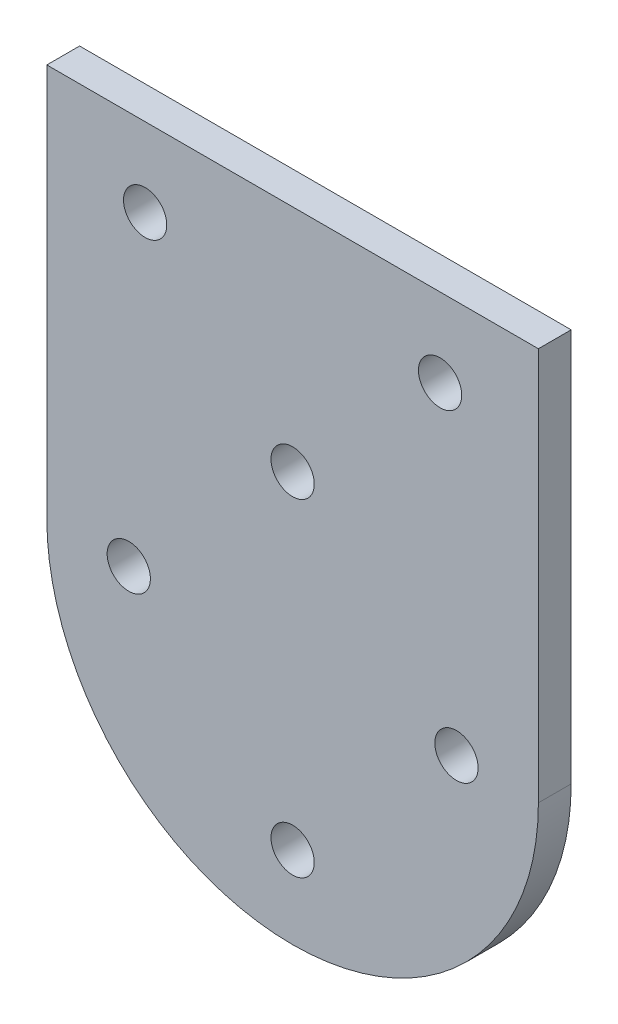
ISO-10303-21;
HEADER;
FILE_DESCRIPTION(('STEP AP214'),'2;1');
FILE_NAME('part.step','',(''),(''),'','','');
FILE_SCHEMA(('AUTOMOTIVE_DESIGN { 1 0 10303 214 1 1 1 1 }'));
ENDSEC;
DATA;
#1=APPLICATION_CONTEXT('core data for automotive mechanical design processes');
#2=APPLICATION_PROTOCOL_DEFINITION('international standard','automotive_design',2000,#1);
#3=PRODUCT_CONTEXT('',#1,'mechanical');
#4=PRODUCT('Part','Part','',(#3));
#5=PRODUCT_RELATED_PRODUCT_CATEGORY('part','',(#4));
#6=PRODUCT_DEFINITION_FORMATION('','',#4);
#7=PRODUCT_DEFINITION_CONTEXT('part definition',#1,'design');
#8=PRODUCT_DEFINITION('design','',#6,#7);
#9=PRODUCT_DEFINITION_SHAPE('','',#8);
#10=(LENGTH_UNIT() NAMED_UNIT(*) SI_UNIT(.MILLI.,.METRE.));
#11=(NAMED_UNIT(*) PLANE_ANGLE_UNIT() SI_UNIT($,.RADIAN.));
#12=(NAMED_UNIT(*) SI_UNIT($,.STERADIAN.) SOLID_ANGLE_UNIT());
#13=UNCERTAINTY_MEASURE_WITH_UNIT(LENGTH_MEASURE(1.E-05),#10,'distance_accuracy_value','');
#14=(GEOMETRIC_REPRESENTATION_CONTEXT(3) GLOBAL_UNCERTAINTY_ASSIGNED_CONTEXT((#13)) GLOBAL_UNIT_ASSIGNED_CONTEXT((#10,
#11,#12)) REPRESENTATION_CONTEXT('',''));
#15=CARTESIAN_POINT('',(0.,0.,0.));
#16=DIRECTION('',(0.,0.,1.));
#17=DIRECTION('',(1.,0.,0.));
#18=AXIS2_PLACEMENT_3D('',#15,#16,#17);
#19=CARTESIAN_POINT('',(0.,0.,0.));
#20=DIRECTION('',(0.,0.,1.));
#21=DIRECTION('',(1.,0.,0.));
#22=AXIS2_PLACEMENT_3D('',#19,#20,#21);
#23=PLANE('',#22);
#24=CARTESIAN_POINT('',(22.5,48.,0.));
#25=DIRECTION('',(0.,0.,-1.));
#26=DIRECTION('',(-1.,0.,0.));
#27=AXIS2_PLACEMENT_3D('',#24,#25,#26);
#28=CIRCLE('',#27,3.325);
#29=CARTESIAN_POINT('',(19.175,48.,0.));
#30=VERTEX_POINT('',#29);
#31=EDGE_CURVE('E165',#30,#30,#28,.T.);
#32=ORIENTED_EDGE('',*,*,#31,.F.);
#33=EDGE_LOOP('',(#32));
#34=FACE_BOUND('',#33,.T.);
#35=CARTESIAN_POINT('',(-22.5,48.,0.));
#36=DIRECTION('',(0.,0.,-1.));
#37=DIRECTION('',(-1.,0.,0.));
#38=AXIS2_PLACEMENT_3D('',#35,#36,#37);
#39=CIRCLE('',#38,3.325);
#40=CARTESIAN_POINT('',(-25.825,48.,0.));
#41=VERTEX_POINT('',#40);
#42=EDGE_CURVE('E156',#41,#41,#39,.T.);
#43=ORIENTED_EDGE('',*,*,#42,.F.);
#44=EDGE_LOOP('',(#43));
#45=FACE_BOUND('',#44,.T.);
#46=CARTESIAN_POINT('',(0.,25.,0.));
#47=DIRECTION('',(0.,0.,-1.));
#48=DIRECTION('',(-1.,0.,0.));
#49=AXIS2_PLACEMENT_3D('',#46,#47,#48);
#50=CIRCLE('',#49,3.325);
#51=CARTESIAN_POINT('',(-3.325,25.,0.));
#52=VERTEX_POINT('',#51);
#53=EDGE_CURVE('E147',#52,#52,#50,.T.);
#54=ORIENTED_EDGE('',*,*,#53,.F.);
#55=EDGE_LOOP('',(#54));
#56=FACE_BOUND('',#55,.T.);
#57=CARTESIAN_POINT('',(-25.,0.,0.));
#58=DIRECTION('',(0.,0.,-1.));
#59=DIRECTION('',(-1.,0.,0.));
#60=AXIS2_PLACEMENT_3D('',#57,#58,#59);
#61=CIRCLE('',#60,3.325);
#62=CARTESIAN_POINT('',(-28.325,0.,0.));
#63=VERTEX_POINT('',#62);
#64=EDGE_CURVE('E138',#63,#63,#61,.T.);
#65=ORIENTED_EDGE('',*,*,#64,.F.);
#66=EDGE_LOOP('',(#65));
#67=FACE_BOUND('',#66,.T.);
#68=CARTESIAN_POINT('',(25.,0.,0.));
#69=DIRECTION('',(0.,0.,-1.));
#70=DIRECTION('',(-1.,0.,0.));
#71=AXIS2_PLACEMENT_3D('',#68,#69,#70);
#72=CIRCLE('',#71,3.325);
#73=CARTESIAN_POINT('',(21.675,0.,0.));
#74=VERTEX_POINT('',#73);
#75=EDGE_CURVE('E120',#74,#74,#72,.T.);
#76=ORIENTED_EDGE('',*,*,#75,.F.);
#77=EDGE_LOOP('',(#76));
#78=FACE_BOUND('',#77,.T.);
#79=DIRECTION('',(0.,-1.,0.));
#80=VECTOR('',#79,1.);
#81=CARTESIAN_POINT('',(-37.5,0.,0.));
#82=LINE('',#81,#80);
#83=CARTESIAN_POINT('',(-37.5,60.,0.));
#84=VERTEX_POINT('',#83);
#85=CARTESIAN_POINT('',(-37.5,0.,0.));
#86=VERTEX_POINT('',#85);
#87=EDGE_CURVE('E101',#84,#86,#82,.T.);
#88=ORIENTED_EDGE('',*,*,#87,.F.);
#89=DIRECTION('',(-1.,0.,0.));
#90=VECTOR('',#89,1.);
#91=CARTESIAN_POINT('',(0.,60.,0.));
#92=LINE('',#91,#90);
#93=CARTESIAN_POINT('',(37.5,60.,0.));
#94=VERTEX_POINT('',#93);
#95=EDGE_CURVE('E77',#94,#84,#92,.T.);
#96=ORIENTED_EDGE('',*,*,#95,.F.);
#97=DIRECTION('',(0.,1.,0.));
#98=VECTOR('',#97,1.);
#99=CARTESIAN_POINT('',(37.5,0.,0.));
#100=LINE('',#99,#98);
#101=CARTESIAN_POINT('',(37.5,0.,0.));
#102=VERTEX_POINT('',#101);
#103=EDGE_CURVE('E71',#102,#94,#100,.T.);
#104=ORIENTED_EDGE('',*,*,#103,.F.);
#105=CARTESIAN_POINT('',(0.,0.,0.));
#106=DIRECTION('',(0.,0.,1.));
#107=DIRECTION('',(1.,0.,0.));
#108=AXIS2_PLACEMENT_3D('',#105,#106,#107);
#109=CIRCLE('',#108,37.5);
#110=EDGE_CURVE('E93',#86,#102,#109,.T.);
#111=ORIENTED_EDGE('',*,*,#110,.F.);
#112=EDGE_LOOP('',(#88,#96,#104,#111));
#113=FACE_BOUND('',#112,.T.);
#114=CARTESIAN_POINT('',(0.,-25.,0.));
#115=DIRECTION('',(0.,0.,-1.));
#116=DIRECTION('',(-1.,0.,0.));
#117=AXIS2_PLACEMENT_3D('',#114,#115,#116);
#118=CIRCLE('',#117,3.325);
#119=CARTESIAN_POINT('',(-3.325,-25.,0.));
#120=VERTEX_POINT('',#119);
#121=EDGE_CURVE('E129',#120,#120,#118,.T.);
#122=ORIENTED_EDGE('',*,*,#121,.F.);
#123=EDGE_LOOP('',(#122));
#124=FACE_BOUND('',#123,.T.);
#125=ADVANCED_FACE('F37',(#34,#45,#56,#67,#78,#113,#124),#23,.F.);
#126=CARTESIAN_POINT('',(-37.5,0.,5.));
#127=DIRECTION('',(1.,0.,0.));
#128=DIRECTION('',(0.,0.,-1.));
#129=AXIS2_PLACEMENT_3D('',#126,#127,#128);
#130=PLANE('',#129);
#131=ORIENTED_EDGE('',*,*,#87,.T.);
#132=DIRECTION('',(0.,0.,-1.));
#133=VECTOR('',#132,1.);
#134=CARTESIAN_POINT('',(-37.5,0.,5.));
#135=LINE('',#134,#133);
#136=CARTESIAN_POINT('',(-37.5,0.,5.));
#137=VERTEX_POINT('',#136);
#138=EDGE_CURVE('E11',#137,#86,#135,.T.);
#139=ORIENTED_EDGE('',*,*,#138,.F.);
#140=DIRECTION('',(0.,-1.,0.));
#141=VECTOR('',#140,1.);
#142=CARTESIAN_POINT('',(-37.5,0.,5.));
#143=LINE('',#142,#141);
#144=CARTESIAN_POINT('',(-37.5,60.,5.));
#145=VERTEX_POINT('',#144);
#146=EDGE_CURVE('E89',#145,#137,#143,.T.);
#147=ORIENTED_EDGE('',*,*,#146,.F.);
#148=DIRECTION('',(0.,0.,-1.));
#149=VECTOR('',#148,1.);
#150=CARTESIAN_POINT('',(-37.5,60.,5.));
#151=LINE('',#150,#149);
#152=EDGE_CURVE('E97',#145,#84,#151,.T.);
#153=ORIENTED_EDGE('',*,*,#152,.T.);
#154=EDGE_LOOP('',(#131,#139,#147,#153));
#155=FACE_BOUND('',#154,.T.);
#156=ADVANCED_FACE('F39',(#155),#130,.F.);
#157=CARTESIAN_POINT('',(0.,0.,5.));
#158=DIRECTION('',(0.,0.,-1.));
#159=DIRECTION('',(-1.,0.,0.));
#160=AXIS2_PLACEMENT_3D('',#157,#158,#159);
#161=CYLINDRICAL_SURFACE('',#160,37.5);
#162=ORIENTED_EDGE('',*,*,#110,.T.);
#163=DIRECTION('',(0.,0.,-1.));
#164=VECTOR('',#163,1.);
#165=CARTESIAN_POINT('',(37.5,0.,5.));
#166=LINE('',#165,#164);
#167=CARTESIAN_POINT('',(37.5,0.,5.));
#168=VERTEX_POINT('',#167);
#169=EDGE_CURVE('E46',#168,#102,#166,.T.);
#170=ORIENTED_EDGE('',*,*,#169,.F.);
#171=CARTESIAN_POINT('',(0.,0.,5.));
#172=DIRECTION('',(0.,0.,1.));
#173=DIRECTION('',(1.,0.,0.));
#174=AXIS2_PLACEMENT_3D('',#171,#172,#173);
#175=CIRCLE('',#174,37.5);
#176=EDGE_CURVE('E84',#137,#168,#175,.T.);
#177=ORIENTED_EDGE('',*,*,#176,.F.);
#178=ORIENTED_EDGE('',*,*,#138,.T.);
#179=EDGE_LOOP('',(#162,#170,#177,#178));
#180=FACE_BOUND('',#179,.T.);
#181=ADVANCED_FACE('F92',(#180),#161,.T.);
#182=CARTESIAN_POINT('',(37.5,0.,5.));
#183=DIRECTION('',(-1.,0.,0.));
#184=DIRECTION('',(0.,0.,1.));
#185=AXIS2_PLACEMENT_3D('',#182,#183,#184);
#186=PLANE('',#185);
#187=ORIENTED_EDGE('',*,*,#103,.T.);
#188=DIRECTION('',(0.,0.,-1.));
#189=VECTOR('',#188,1.);
#190=CARTESIAN_POINT('',(37.5,60.,5.));
#191=LINE('',#190,#189);
#192=CARTESIAN_POINT('',(37.5,60.,5.));
#193=VERTEX_POINT('',#192);
#194=EDGE_CURVE('E94',#193,#94,#191,.T.);
#195=ORIENTED_EDGE('',*,*,#194,.F.);
#196=DIRECTION('',(0.,1.,0.));
#197=VECTOR('',#196,1.);
#198=CARTESIAN_POINT('',(37.5,0.,5.));
#199=LINE('',#198,#197);
#200=EDGE_CURVE('E87',#168,#193,#199,.T.);
#201=ORIENTED_EDGE('',*,*,#200,.F.);
#202=ORIENTED_EDGE('',*,*,#169,.T.);
#203=EDGE_LOOP('',(#187,#195,#201,#202));
#204=FACE_BOUND('',#203,.T.);
#205=ADVANCED_FACE('F95',(#204),#186,.F.);
#206=CARTESIAN_POINT('',(0.,60.,5.));
#207=DIRECTION('',(0.,-1.,0.));
#208=DIRECTION('',(0.,0.,-1.));
#209=AXIS2_PLACEMENT_3D('',#206,#207,#208);
#210=PLANE('',#209);
#211=ORIENTED_EDGE('',*,*,#95,.T.);
#212=ORIENTED_EDGE('',*,*,#152,.F.);
#213=DIRECTION('',(-1.,0.,0.));
#214=VECTOR('',#213,1.);
#215=CARTESIAN_POINT('',(0.,60.,5.));
#216=LINE('',#215,#214);
#217=EDGE_CURVE('E54',#193,#145,#216,.T.);
#218=ORIENTED_EDGE('',*,*,#217,.F.);
#219=ORIENTED_EDGE('',*,*,#194,.T.);
#220=EDGE_LOOP('',(#211,#212,#218,#219));
#221=FACE_BOUND('',#220,.T.);
#222=ADVANCED_FACE('F109',(#221),#210,.F.);
#223=CARTESIAN_POINT('',(0.,0.,5.));
#224=DIRECTION('',(0.,0.,1.));
#225=DIRECTION('',(1.,0.,0.));
#226=AXIS2_PLACEMENT_3D('',#223,#224,#225);
#227=PLANE('',#226);
#228=CARTESIAN_POINT('',(22.5,48.,5.));
#229=DIRECTION('',(0.,0.,-1.));
#230=DIRECTION('',(-1.,0.,0.));
#231=AXIS2_PLACEMENT_3D('',#228,#229,#230);
#232=CIRCLE('',#231,3.29999999999999);
#233=CARTESIAN_POINT('',(19.2,48.,5.));
#234=VERTEX_POINT('',#233);
#235=EDGE_CURVE('E159',#234,#234,#232,.T.);
#236=ORIENTED_EDGE('',*,*,#235,.T.);
#237=EDGE_LOOP('',(#236));
#238=FACE_BOUND('',#237,.T.);
#239=CARTESIAN_POINT('',(-22.5,48.,5.));
#240=DIRECTION('',(0.,0.,-1.));
#241=DIRECTION('',(-1.,0.,0.));
#242=AXIS2_PLACEMENT_3D('',#239,#240,#241);
#243=CIRCLE('',#242,3.29999999999999);
#244=CARTESIAN_POINT('',(-25.8,48.,5.));
#245=VERTEX_POINT('',#244);
#246=EDGE_CURVE('E150',#245,#245,#243,.T.);
#247=ORIENTED_EDGE('',*,*,#246,.T.);
#248=EDGE_LOOP('',(#247));
#249=FACE_BOUND('',#248,.T.);
#250=CARTESIAN_POINT('',(0.,25.,5.));
#251=DIRECTION('',(0.,0.,-1.));
#252=DIRECTION('',(-1.,0.,0.));
#253=AXIS2_PLACEMENT_3D('',#250,#251,#252);
#254=CIRCLE('',#253,3.29999999999999);
#255=CARTESIAN_POINT('',(-3.29999999999999,25.,5.));
#256=VERTEX_POINT('',#255);
#257=EDGE_CURVE('E141',#256,#256,#254,.T.);
#258=ORIENTED_EDGE('',*,*,#257,.T.);
#259=EDGE_LOOP('',(#258));
#260=FACE_BOUND('',#259,.T.);
#261=CARTESIAN_POINT('',(-25.,0.,5.));
#262=DIRECTION('',(0.,0.,-1.));
#263=DIRECTION('',(-1.,0.,0.));
#264=AXIS2_PLACEMENT_3D('',#261,#262,#263);
#265=CIRCLE('',#264,3.29999999999999);
#266=CARTESIAN_POINT('',(-28.3,0.,5.));
#267=VERTEX_POINT('',#266);
#268=EDGE_CURVE('E132',#267,#267,#265,.T.);
#269=ORIENTED_EDGE('',*,*,#268,.T.);
#270=EDGE_LOOP('',(#269));
#271=FACE_BOUND('',#270,.T.);
#272=CARTESIAN_POINT('',(0.,-25.,5.));
#273=DIRECTION('',(0.,0.,-1.));
#274=DIRECTION('',(-1.,0.,0.));
#275=AXIS2_PLACEMENT_3D('',#272,#273,#274);
#276=CIRCLE('',#275,3.29999999999999);
#277=CARTESIAN_POINT('',(-3.29999999999999,-25.,5.));
#278=VERTEX_POINT('',#277);
#279=EDGE_CURVE('E123',#278,#278,#276,.T.);
#280=ORIENTED_EDGE('',*,*,#279,.T.);
#281=EDGE_LOOP('',(#280));
#282=FACE_BOUND('',#281,.T.);
#283=CARTESIAN_POINT('',(25.,0.,5.));
#284=DIRECTION('',(0.,0.,-1.));
#285=DIRECTION('',(-1.,0.,0.));
#286=AXIS2_PLACEMENT_3D('',#283,#284,#285);
#287=CIRCLE('',#286,3.29999999999999);
#288=CARTESIAN_POINT('',(21.7,0.,5.));
#289=VERTEX_POINT('',#288);
#290=EDGE_CURVE('E104',#289,#289,#287,.T.);
#291=ORIENTED_EDGE('',*,*,#290,.T.);
#292=EDGE_LOOP('',(#291));
#293=FACE_BOUND('',#292,.T.);
#294=ORIENTED_EDGE('',*,*,#146,.T.);
#295=ORIENTED_EDGE('',*,*,#176,.T.);
#296=ORIENTED_EDGE('',*,*,#200,.T.);
#297=ORIENTED_EDGE('',*,*,#217,.T.);
#298=EDGE_LOOP('',(#294,#295,#296,#297));
#299=FACE_BOUND('',#298,.T.);
#300=ADVANCED_FACE('F85',(#238,#249,#260,#271,#282,#293,#299),#227,.T.);
#301=CARTESIAN_POINT('',(25.,0.,0.));
#302=DIRECTION('',(0.,0.,-1.));
#303=DIRECTION('',(-1.,0.,0.));
#304=AXIS2_PLACEMENT_3D('',#301,#302,#303);
#305=CYLINDRICAL_SURFACE('',#304,3.29999999999999);
#306=ORIENTED_EDGE('',*,*,#290,.F.);
#307=EDGE_LOOP('',(#306));
#308=FACE_BOUND('',#307,.T.);
#309=CARTESIAN_POINT('',(25.,0.,0.0249999999999972));
#310=DIRECTION('',(0.,0.,-1.));
#311=DIRECTION('',(-1.,0.,0.));
#312=AXIS2_PLACEMENT_3D('',#309,#310,#311);
#313=CIRCLE('',#312,3.29999999999999);
#314=CARTESIAN_POINT('',(21.7,0.,0.0249999999999972));
#315=VERTEX_POINT('',#314);
#316=EDGE_CURVE('E117',#315,#315,#313,.T.);
#317=ORIENTED_EDGE('',*,*,#316,.T.);
#318=EDGE_LOOP('',(#317));
#319=FACE_BOUND('',#318,.T.);
#320=ADVANCED_FACE('F185',(#308,#319),#305,.F.);
#321=CARTESIAN_POINT('',(25.,0.,0.));
#322=DIRECTION('',(0.,0.,-1.));
#323=DIRECTION('',(-1.,0.,0.));
#324=AXIS2_PLACEMENT_3D('',#321,#322,#323);
#325=CONICAL_SURFACE('',#324,3.325,0.78539816339776);
#326=ORIENTED_EDGE('',*,*,#316,.F.);
#327=EDGE_LOOP('',(#326));
#328=FACE_BOUND('',#327,.T.);
#329=ORIENTED_EDGE('',*,*,#75,.T.);
#330=EDGE_LOOP('',(#329));
#331=FACE_BOUND('',#330,.T.);
#332=ADVANCED_FACE('F182',(#328,#331),#325,.F.);
#333=CARTESIAN_POINT('',(0.,-25.,0.));
#334=DIRECTION('',(0.,0.,-1.));
#335=DIRECTION('',(-1.,0.,0.));
#336=AXIS2_PLACEMENT_3D('',#333,#334,#335);
#337=CYLINDRICAL_SURFACE('',#336,3.29999999999999);
#338=ORIENTED_EDGE('',*,*,#279,.F.);
#339=EDGE_LOOP('',(#338));
#340=FACE_BOUND('',#339,.T.);
#341=CARTESIAN_POINT('',(0.,-25.,0.0249999999999972));
#342=DIRECTION('',(0.,0.,-1.));
#343=DIRECTION('',(-1.,0.,0.));
#344=AXIS2_PLACEMENT_3D('',#341,#342,#343);
#345=CIRCLE('',#344,3.29999999999999);
#346=CARTESIAN_POINT('',(-3.29999999999999,-25.,0.0249999999999972));
#347=VERTEX_POINT('',#346);
#348=EDGE_CURVE('E126',#347,#347,#345,.T.);
#349=ORIENTED_EDGE('',*,*,#348,.T.);
#350=EDGE_LOOP('',(#349));
#351=FACE_BOUND('',#350,.T.);
#352=ADVANCED_FACE('F184',(#340,#351),#337,.F.);
#353=CARTESIAN_POINT('',(0.,-25.,0.));
#354=DIRECTION('',(0.,0.,-1.));
#355=DIRECTION('',(-1.,0.,0.));
#356=AXIS2_PLACEMENT_3D('',#353,#354,#355);
#357=CONICAL_SURFACE('',#356,3.325,0.785398163397726);
#358=ORIENTED_EDGE('',*,*,#348,.F.);
#359=EDGE_LOOP('',(#358));
#360=FACE_BOUND('',#359,.T.);
#361=ORIENTED_EDGE('',*,*,#121,.T.);
#362=EDGE_LOOP('',(#361));
#363=FACE_BOUND('',#362,.T.);
#364=ADVANCED_FACE('F192',(#360,#363),#357,.F.);
#365=CARTESIAN_POINT('',(-25.,0.,0.));
#366=DIRECTION('',(0.,0.,-1.));
#367=DIRECTION('',(-1.,0.,0.));
#368=AXIS2_PLACEMENT_3D('',#365,#366,#367);
#369=CYLINDRICAL_SURFACE('',#368,3.29999999999999);
#370=ORIENTED_EDGE('',*,*,#268,.F.);
#371=EDGE_LOOP('',(#370));
#372=FACE_BOUND('',#371,.T.);
#373=CARTESIAN_POINT('',(-25.,0.,0.0249999999999972));
#374=DIRECTION('',(0.,0.,-1.));
#375=DIRECTION('',(-1.,0.,0.));
#376=AXIS2_PLACEMENT_3D('',#373,#374,#375);
#377=CIRCLE('',#376,3.29999999999999);
#378=CARTESIAN_POINT('',(-28.3,0.,0.0249999999999972));
#379=VERTEX_POINT('',#378);
#380=EDGE_CURVE('E135',#379,#379,#377,.T.);
#381=ORIENTED_EDGE('',*,*,#380,.T.);
#382=EDGE_LOOP('',(#381));
#383=FACE_BOUND('',#382,.T.);
#384=ADVANCED_FACE('F251',(#372,#383),#369,.F.);
#385=CARTESIAN_POINT('',(-25.,0.,0.));
#386=DIRECTION('',(0.,0.,-1.));
#387=DIRECTION('',(-1.,0.,0.));
#388=AXIS2_PLACEMENT_3D('',#385,#386,#387);
#389=CONICAL_SURFACE('',#388,3.325,0.78539816339776);
#390=ORIENTED_EDGE('',*,*,#380,.F.);
#391=EDGE_LOOP('',(#390));
#392=FACE_BOUND('',#391,.T.);
#393=ORIENTED_EDGE('',*,*,#64,.T.);
#394=EDGE_LOOP('',(#393));
#395=FACE_BOUND('',#394,.T.);
#396=ADVANCED_FACE('F260',(#392,#395),#389,.F.);
#397=CARTESIAN_POINT('',(0.,25.,0.));
#398=DIRECTION('',(0.,0.,-1.));
#399=DIRECTION('',(-1.,0.,0.));
#400=AXIS2_PLACEMENT_3D('',#397,#398,#399);
#401=CYLINDRICAL_SURFACE('',#400,3.29999999999999);
#402=ORIENTED_EDGE('',*,*,#257,.F.);
#403=EDGE_LOOP('',(#402));
#404=FACE_BOUND('',#403,.T.);
#405=CARTESIAN_POINT('',(0.,25.,0.0249999999999972));
#406=DIRECTION('',(0.,0.,-1.));
#407=DIRECTION('',(-1.,0.,0.));
#408=AXIS2_PLACEMENT_3D('',#405,#406,#407);
#409=CIRCLE('',#408,3.29999999999999);
#410=CARTESIAN_POINT('',(-3.29999999999999,25.,0.0249999999999972));
#411=VERTEX_POINT('',#410);
#412=EDGE_CURVE('E144',#411,#411,#409,.T.);
#413=ORIENTED_EDGE('',*,*,#412,.T.);
#414=EDGE_LOOP('',(#413));
#415=FACE_BOUND('',#414,.T.);
#416=ADVANCED_FACE('F270',(#404,#415),#401,.F.);
#417=CARTESIAN_POINT('',(0.,25.,0.));
#418=DIRECTION('',(0.,0.,-1.));
#419=DIRECTION('',(-1.,0.,0.));
#420=AXIS2_PLACEMENT_3D('',#417,#418,#419);
#421=CONICAL_SURFACE('',#420,3.325,0.785398163397726);
#422=ORIENTED_EDGE('',*,*,#412,.F.);
#423=EDGE_LOOP('',(#422));
#424=FACE_BOUND('',#423,.T.);
#425=ORIENTED_EDGE('',*,*,#53,.T.);
#426=EDGE_LOOP('',(#425));
#427=FACE_BOUND('',#426,.T.);
#428=ADVANCED_FACE('F280',(#424,#427),#421,.F.);
#429=CARTESIAN_POINT('',(-22.5,48.,0.));
#430=DIRECTION('',(0.,0.,-1.));
#431=DIRECTION('',(-1.,0.,0.));
#432=AXIS2_PLACEMENT_3D('',#429,#430,#431);
#433=CYLINDRICAL_SURFACE('',#432,3.29999999999999);
#434=ORIENTED_EDGE('',*,*,#246,.F.);
#435=EDGE_LOOP('',(#434));
#436=FACE_BOUND('',#435,.T.);
#437=CARTESIAN_POINT('',(-22.5,48.,0.0249999999999972));
#438=DIRECTION('',(0.,0.,-1.));
#439=DIRECTION('',(-1.,0.,0.));
#440=AXIS2_PLACEMENT_3D('',#437,#438,#439);
#441=CIRCLE('',#440,3.29999999999999);
#442=CARTESIAN_POINT('',(-25.8,48.,0.0249999999999972));
#443=VERTEX_POINT('',#442);
#444=EDGE_CURVE('E153',#443,#443,#441,.T.);
#445=ORIENTED_EDGE('',*,*,#444,.T.);
#446=EDGE_LOOP('',(#445));
#447=FACE_BOUND('',#446,.T.);
#448=ADVANCED_FACE('F290',(#436,#447),#433,.F.);
#449=CARTESIAN_POINT('',(-22.5,48.,0.));
#450=DIRECTION('',(0.,0.,-1.));
#451=DIRECTION('',(-1.,0.,0.));
#452=AXIS2_PLACEMENT_3D('',#449,#450,#451);
#453=CONICAL_SURFACE('',#452,3.325,0.785398163397691);
#454=ORIENTED_EDGE('',*,*,#444,.F.);
#455=EDGE_LOOP('',(#454));
#456=FACE_BOUND('',#455,.T.);
#457=ORIENTED_EDGE('',*,*,#42,.T.);
#458=EDGE_LOOP('',(#457));
#459=FACE_BOUND('',#458,.T.);
#460=ADVANCED_FACE('F300',(#456,#459),#453,.F.);
#461=CARTESIAN_POINT('',(22.5,48.,0.));
#462=DIRECTION('',(0.,0.,-1.));
#463=DIRECTION('',(-1.,0.,0.));
#464=AXIS2_PLACEMENT_3D('',#461,#462,#463);
#465=CYLINDRICAL_SURFACE('',#464,3.29999999999999);
#466=ORIENTED_EDGE('',*,*,#235,.F.);
#467=EDGE_LOOP('',(#466));
#468=FACE_BOUND('',#467,.T.);
#469=CARTESIAN_POINT('',(22.5,48.,0.0249999999999972));
#470=DIRECTION('',(0.,0.,-1.));
#471=DIRECTION('',(-1.,0.,0.));
#472=AXIS2_PLACEMENT_3D('',#469,#470,#471);
#473=CIRCLE('',#472,3.29999999999999);
#474=CARTESIAN_POINT('',(19.2,48.,0.0249999999999972));
#475=VERTEX_POINT('',#474);
#476=EDGE_CURVE('E162',#475,#475,#473,.T.);
#477=ORIENTED_EDGE('',*,*,#476,.T.);
#478=EDGE_LOOP('',(#477));
#479=FACE_BOUND('',#478,.T.);
#480=ADVANCED_FACE('F310',(#468,#479),#465,.F.);
#481=CARTESIAN_POINT('',(22.5,48.,0.));
#482=DIRECTION('',(0.,0.,-1.));
#483=DIRECTION('',(-1.,0.,0.));
#484=AXIS2_PLACEMENT_3D('',#481,#482,#483);
#485=CONICAL_SURFACE('',#484,3.325,0.785398163397691);
#486=ORIENTED_EDGE('',*,*,#476,.F.);
#487=EDGE_LOOP('',(#486));
#488=FACE_BOUND('',#487,.T.);
#489=ORIENTED_EDGE('',*,*,#31,.T.);
#490=EDGE_LOOP('',(#489));
#491=FACE_BOUND('',#490,.T.);
#492=ADVANCED_FACE('F169',(#488,#491),#485,.F.);
#493=CLOSED_SHELL('',(#125,#156,#181,#205,#222,#300,#320,#332,#352,#364,#384,#396,#416,#428,
#448,#460,#480,#492));
#494=MANIFOLD_SOLID_BREP('B2',#493);
#495=ADVANCED_BREP_SHAPE_REPRESENTATION('',(#18,#494),#14);
#496=SHAPE_DEFINITION_REPRESENTATION(#9,#495);
ENDSEC;
END-ISO-10303-21;
